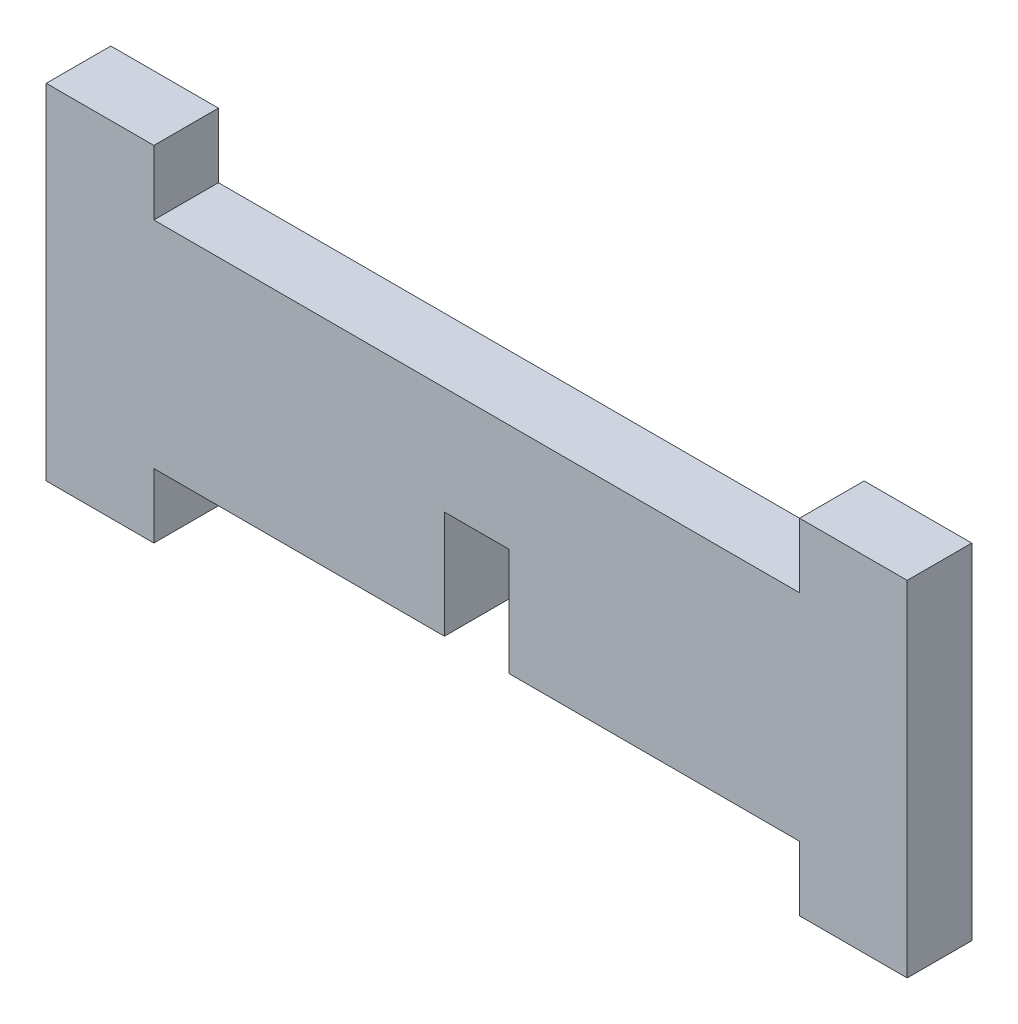
ISO-10303-21;
HEADER;
FILE_DESCRIPTION(('STEP AP214'),'2;1');
FILE_NAME('part.step','',(''),(''),'','','');
FILE_SCHEMA(('AUTOMOTIVE_DESIGN { 1 0 10303 214 1 1 1 1 }'));
ENDSEC;
DATA;
#1=APPLICATION_CONTEXT('core data for automotive mechanical design processes');
#2=APPLICATION_PROTOCOL_DEFINITION('international standard','automotive_design',2000,#1);
#3=PRODUCT_CONTEXT('',#1,'mechanical');
#4=PRODUCT('Part','Part','',(#3));
#5=PRODUCT_RELATED_PRODUCT_CATEGORY('part','',(#4));
#6=PRODUCT_DEFINITION_FORMATION('','',#4);
#7=PRODUCT_DEFINITION_CONTEXT('part definition',#1,'design');
#8=PRODUCT_DEFINITION('design','',#6,#7);
#9=PRODUCT_DEFINITION_SHAPE('','',#8);
#10=(LENGTH_UNIT() NAMED_UNIT(*) SI_UNIT(.MILLI.,.METRE.));
#11=(NAMED_UNIT(*) PLANE_ANGLE_UNIT() SI_UNIT($,.RADIAN.));
#12=(NAMED_UNIT(*) SI_UNIT($,.STERADIAN.) SOLID_ANGLE_UNIT());
#13=UNCERTAINTY_MEASURE_WITH_UNIT(LENGTH_MEASURE(1.E-05),#10,'distance_accuracy_value','');
#14=(GEOMETRIC_REPRESENTATION_CONTEXT(3) GLOBAL_UNCERTAINTY_ASSIGNED_CONTEXT((#13)) GLOBAL_UNIT_ASSIGNED_CONTEXT((#10,
#11,#12)) REPRESENTATION_CONTEXT('',''));
#15=CARTESIAN_POINT('',(0.,0.,0.));
#16=DIRECTION('',(0.,0.,1.));
#17=DIRECTION('',(1.,0.,0.));
#18=AXIS2_PLACEMENT_3D('',#15,#16,#17);
#19=CARTESIAN_POINT('',(-34.5604390862944,-10.4851945854484,3.));
#20=DIRECTION('',(0.,-1.,0.));
#21=DIRECTION('',(1.,0.,0.));
#22=AXIS2_PLACEMENT_3D('',#19,#20,#21);
#23=PLANE('',#22);
#24=DIRECTION('',(-1.,0.,0.));
#25=VECTOR('',#24,1.);
#26=CARTESIAN_POINT('',(-34.5604390862944,-10.4851945854484,0.));
#27=LINE('',#26,#25);
#28=CARTESIAN_POINT('',(-34.5604390862944,-10.4851945854484,0.));
#29=VERTEX_POINT('',#28);
#30=CARTESIAN_POINT('',(-39.5604390862944,-10.4851945854484,0.));
#31=VERTEX_POINT('',#30);
#32=EDGE_CURVE('E177',#29,#31,#27,.T.);
#33=ORIENTED_EDGE('',*,*,#32,.T.);
#34=DIRECTION('',(0.,0.,-1.));
#35=VECTOR('',#34,1.);
#36=CARTESIAN_POINT('',(-39.5604390862944,-10.4851945854484,3.));
#37=LINE('',#36,#35);
#38=CARTESIAN_POINT('',(-39.5604390862944,-10.4851945854484,3.));
#39=VERTEX_POINT('',#38);
#40=EDGE_CURVE('E11',#39,#31,#37,.T.);
#41=ORIENTED_EDGE('',*,*,#40,.F.);
#42=DIRECTION('',(-1.,0.,0.));
#43=VECTOR('',#42,1.);
#44=CARTESIAN_POINT('',(-34.5604390862944,-10.4851945854484,3.));
#45=LINE('',#44,#43);
#46=CARTESIAN_POINT('',(-34.5604390862944,-10.4851945854484,3.));
#47=VERTEX_POINT('',#46);
#48=EDGE_CURVE('E207',#47,#39,#45,.T.);
#49=ORIENTED_EDGE('',*,*,#48,.F.);
#50=DIRECTION('',(0.,0.,-1.));
#51=VECTOR('',#50,1.);
#52=CARTESIAN_POINT('',(-34.5604390862944,-10.4851945854484,3.));
#53=LINE('',#52,#51);
#54=EDGE_CURVE('E173',#47,#29,#53,.T.);
#55=ORIENTED_EDGE('',*,*,#54,.T.);
#56=EDGE_LOOP('',(#33,#41,#49,#55));
#57=FACE_BOUND('',#56,.T.);
#58=ADVANCED_FACE('F33',(#57),#23,.F.);
#59=CARTESIAN_POINT('',(-39.5604390862944,-10.4851945854484,3.));
#60=DIRECTION('',(1.,0.,0.));
#61=DIRECTION('',(0.,1.,0.));
#62=AXIS2_PLACEMENT_3D('',#59,#60,#61);
#63=PLANE('',#62);
#64=DIRECTION('',(0.,-1.,0.));
#65=VECTOR('',#64,1.);
#66=CARTESIAN_POINT('',(-39.5604390862944,-10.4851945854484,0.));
#67=LINE('',#66,#65);
#68=CARTESIAN_POINT('',(-39.5604390862944,-26.4851945854484,0.));
#69=VERTEX_POINT('',#68);
#70=EDGE_CURVE('E180',#31,#69,#67,.T.);
#71=ORIENTED_EDGE('',*,*,#70,.T.);
#72=DIRECTION('',(0.,0.,-1.));
#73=VECTOR('',#72,1.);
#74=CARTESIAN_POINT('',(-39.5604390862944,-26.4851945854484,3.));
#75=LINE('',#74,#73);
#76=CARTESIAN_POINT('',(-39.5604390862944,-26.4851945854484,3.));
#77=VERTEX_POINT('',#76);
#78=EDGE_CURVE('E41',#77,#69,#75,.T.);
#79=ORIENTED_EDGE('',*,*,#78,.F.);
#80=DIRECTION('',(0.,-1.,0.));
#81=VECTOR('',#80,1.);
#82=CARTESIAN_POINT('',(-39.5604390862944,-10.4851945854484,3.));
#83=LINE('',#82,#81);
#84=EDGE_CURVE('E116',#39,#77,#83,.T.);
#85=ORIENTED_EDGE('',*,*,#84,.F.);
#86=ORIENTED_EDGE('',*,*,#40,.T.);
#87=EDGE_LOOP('',(#71,#79,#85,#86));
#88=FACE_BOUND('',#87,.T.);
#89=ADVANCED_FACE('F305',(#88),#63,.F.);
#90=CARTESIAN_POINT('',(-39.5604390862944,-26.4851945854484,3.));
#91=DIRECTION('',(0.,1.,0.));
#92=DIRECTION('',(0.,0.,1.));
#93=AXIS2_PLACEMENT_3D('',#90,#91,#92);
#94=PLANE('',#93);
#95=DIRECTION('',(1.,0.,0.));
#96=VECTOR('',#95,1.);
#97=CARTESIAN_POINT('',(-39.5604390862944,-26.4851945854484,0.));
#98=LINE('',#97,#96);
#99=CARTESIAN_POINT('',(-34.5604390862944,-26.4851945854484,0.));
#100=VERTEX_POINT('',#99);
#101=EDGE_CURVE('E182',#69,#100,#98,.T.);
#102=ORIENTED_EDGE('',*,*,#101,.T.);
#103=DIRECTION('',(0.,0.,-1.));
#104=VECTOR('',#103,1.);
#105=CARTESIAN_POINT('',(-34.5604390862944,-26.4851945854484,3.));
#106=LINE('',#105,#104);
#107=CARTESIAN_POINT('',(-34.5604390862944,-26.4851945854484,3.));
#108=VERTEX_POINT('',#107);
#109=EDGE_CURVE('E238',#108,#100,#106,.T.);
#110=ORIENTED_EDGE('',*,*,#109,.F.);
#111=DIRECTION('',(1.,0.,0.));
#112=VECTOR('',#111,1.);
#113=CARTESIAN_POINT('',(-39.5604390862944,-26.4851945854484,3.));
#114=LINE('',#113,#112);
#115=EDGE_CURVE('E246',#77,#108,#114,.T.);
#116=ORIENTED_EDGE('',*,*,#115,.F.);
#117=ORIENTED_EDGE('',*,*,#78,.T.);
#118=EDGE_LOOP('',(#102,#110,#116,#117));
#119=FACE_BOUND('',#118,.T.);
#120=ADVANCED_FACE('F244',(#119),#94,.F.);
#121=CARTESIAN_POINT('',(-34.5604390862944,-26.4851945854484,3.));
#122=DIRECTION('',(-1.,0.,0.));
#123=DIRECTION('',(0.,0.,1.));
#124=AXIS2_PLACEMENT_3D('',#121,#122,#123);
#125=PLANE('',#124);
#126=DIRECTION('',(0.,1.,0.));
#127=VECTOR('',#126,1.);
#128=CARTESIAN_POINT('',(-34.5604390862944,-26.4851945854484,0.));
#129=LINE('',#128,#127);
#130=CARTESIAN_POINT('',(-34.5604390862944,-23.4851945854484,0.));
#131=VERTEX_POINT('',#130);
#132=EDGE_CURVE('E184',#100,#131,#129,.T.);
#133=ORIENTED_EDGE('',*,*,#132,.T.);
#134=DIRECTION('',(0.,0.,-1.));
#135=VECTOR('',#134,1.);
#136=CARTESIAN_POINT('',(-34.5604390862944,-23.4851945854484,3.));
#137=LINE('',#136,#135);
#138=CARTESIAN_POINT('',(-34.5604390862944,-23.4851945854484,3.));
#139=VERTEX_POINT('',#138);
#140=EDGE_CURVE('E235',#139,#131,#137,.T.);
#141=ORIENTED_EDGE('',*,*,#140,.F.);
#142=DIRECTION('',(0.,1.,0.));
#143=VECTOR('',#142,1.);
#144=CARTESIAN_POINT('',(-34.5604390862944,-26.4851945854484,3.));
#145=LINE('',#144,#143);
#146=EDGE_CURVE('E264',#108,#139,#145,.T.);
#147=ORIENTED_EDGE('',*,*,#146,.F.);
#148=ORIENTED_EDGE('',*,*,#109,.T.);
#149=EDGE_LOOP('',(#133,#141,#147,#148));
#150=FACE_BOUND('',#149,.T.);
#151=ADVANCED_FACE('F255',(#150),#125,.F.);
#152=CARTESIAN_POINT('',(-34.5604390862944,-23.4851945854484,3.));
#153=DIRECTION('',(0.,1.,0.));
#154=DIRECTION('',(0.,0.,1.));
#155=AXIS2_PLACEMENT_3D('',#152,#153,#154);
#156=PLANE('',#155);
#157=DIRECTION('',(1.,0.,0.));
#158=VECTOR('',#157,1.);
#159=CARTESIAN_POINT('',(-34.5604390862944,-23.4851945854484,0.));
#160=LINE('',#159,#158);
#161=CARTESIAN_POINT('',(-21.0604390862944,-23.4851945854484,0.));
#162=VERTEX_POINT('',#161);
#163=EDGE_CURVE('E186',#131,#162,#160,.T.);
#164=ORIENTED_EDGE('',*,*,#163,.T.);
#165=DIRECTION('',(0.,0.,-1.));
#166=VECTOR('',#165,1.);
#167=CARTESIAN_POINT('',(-21.0604390862944,-23.4851945854484,3.));
#168=LINE('',#167,#166);
#169=CARTESIAN_POINT('',(-21.0604390862944,-23.4851945854484,3.));
#170=VERTEX_POINT('',#169);
#171=EDGE_CURVE('E232',#170,#162,#168,.T.);
#172=ORIENTED_EDGE('',*,*,#171,.F.);
#173=DIRECTION('',(1.,0.,0.));
#174=VECTOR('',#173,1.);
#175=CARTESIAN_POINT('',(-34.5604390862944,-23.4851945854484,3.));
#176=LINE('',#175,#174);
#177=EDGE_CURVE('E261',#139,#170,#176,.T.);
#178=ORIENTED_EDGE('',*,*,#177,.F.);
#179=ORIENTED_EDGE('',*,*,#140,.T.);
#180=EDGE_LOOP('',(#164,#172,#178,#179));
#181=FACE_BOUND('',#180,.T.);
#182=ADVANCED_FACE('F259',(#181),#156,.F.);
#183=CARTESIAN_POINT('',(-21.0604390862944,-23.4851945854484,3.));
#184=DIRECTION('',(-1.,0.,0.));
#185=DIRECTION('',(0.,0.,1.));
#186=AXIS2_PLACEMENT_3D('',#183,#184,#185);
#187=PLANE('',#186);
#188=DIRECTION('',(0.,1.,0.));
#189=VECTOR('',#188,1.);
#190=CARTESIAN_POINT('',(-21.0604390862944,-23.4851945854484,0.));
#191=LINE('',#190,#189);
#192=CARTESIAN_POINT('',(-21.0604390862944,-18.4851945854484,0.));
#193=VERTEX_POINT('',#192);
#194=EDGE_CURVE('E188',#162,#193,#191,.T.);
#195=ORIENTED_EDGE('',*,*,#194,.T.);
#196=DIRECTION('',(0.,0.,-1.));
#197=VECTOR('',#196,1.);
#198=CARTESIAN_POINT('',(-21.0604390862944,-18.4851945854484,3.));
#199=LINE('',#198,#197);
#200=CARTESIAN_POINT('',(-21.0604390862944,-18.4851945854484,3.));
#201=VERTEX_POINT('',#200);
#202=EDGE_CURVE('E229',#201,#193,#199,.T.);
#203=ORIENTED_EDGE('',*,*,#202,.F.);
#204=DIRECTION('',(0.,1.,0.));
#205=VECTOR('',#204,1.);
#206=CARTESIAN_POINT('',(-21.0604390862944,-23.4851945854484,3.));
#207=LINE('',#206,#205);
#208=EDGE_CURVE('E263',#170,#201,#207,.T.);
#209=ORIENTED_EDGE('',*,*,#208,.F.);
#210=ORIENTED_EDGE('',*,*,#171,.T.);
#211=EDGE_LOOP('',(#195,#203,#209,#210));
#212=FACE_BOUND('',#211,.T.);
#213=ADVANCED_FACE('F318',(#212),#187,.F.);
#214=CARTESIAN_POINT('',(-21.0604390862944,-18.4851945854484,3.));
#215=DIRECTION('',(0.,1.,0.));
#216=DIRECTION('',(0.,0.,1.));
#217=AXIS2_PLACEMENT_3D('',#214,#215,#216);
#218=PLANE('',#217);
#219=DIRECTION('',(1.,0.,0.));
#220=VECTOR('',#219,1.);
#221=CARTESIAN_POINT('',(-21.0604390862944,-18.4851945854484,0.));
#222=LINE('',#221,#220);
#223=CARTESIAN_POINT('',(-18.0604390862944,-18.4851945854484,0.));
#224=VERTEX_POINT('',#223);
#225=EDGE_CURVE('E190',#193,#224,#222,.T.);
#226=ORIENTED_EDGE('',*,*,#225,.T.);
#227=DIRECTION('',(0.,0.,-1.));
#228=VECTOR('',#227,1.);
#229=CARTESIAN_POINT('',(-18.0604390862944,-18.4851945854484,3.));
#230=LINE('',#229,#228);
#231=CARTESIAN_POINT('',(-18.0604390862944,-18.4851945854484,3.));
#232=VERTEX_POINT('',#231);
#233=EDGE_CURVE('E226',#232,#224,#230,.T.);
#234=ORIENTED_EDGE('',*,*,#233,.F.);
#235=DIRECTION('',(1.,0.,0.));
#236=VECTOR('',#235,1.);
#237=CARTESIAN_POINT('',(-21.0604390862944,-18.4851945854484,3.));
#238=LINE('',#237,#236);
#239=EDGE_CURVE('E266',#201,#232,#238,.T.);
#240=ORIENTED_EDGE('',*,*,#239,.F.);
#241=ORIENTED_EDGE('',*,*,#202,.T.);
#242=EDGE_LOOP('',(#226,#234,#240,#241));
#243=FACE_BOUND('',#242,.T.);
#244=ADVANCED_FACE('F321',(#243),#218,.F.);
#245=CARTESIAN_POINT('',(-18.0604390862944,-18.4851945854484,3.));
#246=DIRECTION('',(1.,0.,0.));
#247=DIRECTION('',(0.,1.,0.));
#248=AXIS2_PLACEMENT_3D('',#245,#246,#247);
#249=PLANE('',#248);
#250=DIRECTION('',(0.,-1.,0.));
#251=VECTOR('',#250,1.);
#252=CARTESIAN_POINT('',(-18.0604390862944,-18.4851945854484,0.));
#253=LINE('',#252,#251);
#254=CARTESIAN_POINT('',(-18.0604390862944,-23.4851945854484,0.));
#255=VERTEX_POINT('',#254);
#256=EDGE_CURVE('E192',#224,#255,#253,.T.);
#257=ORIENTED_EDGE('',*,*,#256,.T.);
#258=DIRECTION('',(0.,0.,-1.));
#259=VECTOR('',#258,1.);
#260=CARTESIAN_POINT('',(-18.0604390862944,-23.4851945854484,3.));
#261=LINE('',#260,#259);
#262=CARTESIAN_POINT('',(-18.0604390862944,-23.4851945854484,3.));
#263=VERTEX_POINT('',#262);
#264=EDGE_CURVE('E223',#263,#255,#261,.T.);
#265=ORIENTED_EDGE('',*,*,#264,.F.);
#266=DIRECTION('',(0.,-1.,0.));
#267=VECTOR('',#266,1.);
#268=CARTESIAN_POINT('',(-18.0604390862944,-18.4851945854484,3.));
#269=LINE('',#268,#267);
#270=EDGE_CURVE('E272',#232,#263,#269,.T.);
#271=ORIENTED_EDGE('',*,*,#270,.F.);
#272=ORIENTED_EDGE('',*,*,#233,.T.);
#273=EDGE_LOOP('',(#257,#265,#271,#272));
#274=FACE_BOUND('',#273,.T.);
#275=ADVANCED_FACE('F325',(#274),#249,.F.);
#276=CARTESIAN_POINT('',(-18.0604390862944,-23.4851945854484,3.));
#277=DIRECTION('',(0.,1.,0.));
#278=DIRECTION('',(0.,0.,1.));
#279=AXIS2_PLACEMENT_3D('',#276,#277,#278);
#280=PLANE('',#279);
#281=DIRECTION('',(1.,0.,0.));
#282=VECTOR('',#281,1.);
#283=CARTESIAN_POINT('',(-18.0604390862944,-23.4851945854484,0.));
#284=LINE('',#283,#282);
#285=CARTESIAN_POINT('',(-4.56043908629442,-23.4851945854484,0.));
#286=VERTEX_POINT('',#285);
#287=EDGE_CURVE('E194',#255,#286,#284,.T.);
#288=ORIENTED_EDGE('',*,*,#287,.T.);
#289=DIRECTION('',(0.,0.,-1.));
#290=VECTOR('',#289,1.);
#291=CARTESIAN_POINT('',(-4.56043908629442,-23.4851945854484,3.));
#292=LINE('',#291,#290);
#293=CARTESIAN_POINT('',(-4.56043908629442,-23.4851945854484,3.));
#294=VERTEX_POINT('',#293);
#295=EDGE_CURVE('E220',#294,#286,#292,.T.);
#296=ORIENTED_EDGE('',*,*,#295,.F.);
#297=DIRECTION('',(1.,0.,0.));
#298=VECTOR('',#297,1.);
#299=CARTESIAN_POINT('',(-18.0604390862944,-23.4851945854484,3.));
#300=LINE('',#299,#298);
#301=EDGE_CURVE('E274',#263,#294,#300,.T.);
#302=ORIENTED_EDGE('',*,*,#301,.F.);
#303=ORIENTED_EDGE('',*,*,#264,.T.);
#304=EDGE_LOOP('',(#288,#296,#302,#303));
#305=FACE_BOUND('',#304,.T.);
#306=ADVANCED_FACE('F329',(#305),#280,.F.);
#307=CARTESIAN_POINT('',(-4.56043908629442,-23.4851945854484,3.));
#308=DIRECTION('',(1.,0.,0.));
#309=DIRECTION('',(0.,0.,-1.));
#310=AXIS2_PLACEMENT_3D('',#307,#308,#309);
#311=PLANE('',#310);
#312=DIRECTION('',(0.,-1.,0.));
#313=VECTOR('',#312,1.);
#314=CARTESIAN_POINT('',(-4.56043908629442,-23.4851945854484,0.));
#315=LINE('',#314,#313);
#316=CARTESIAN_POINT('',(-4.56043908629442,-26.4851945854484,0.));
#317=VERTEX_POINT('',#316);
#318=EDGE_CURVE('E196',#286,#317,#315,.T.);
#319=ORIENTED_EDGE('',*,*,#318,.T.);
#320=DIRECTION('',(0.,0.,-1.));
#321=VECTOR('',#320,1.);
#322=CARTESIAN_POINT('',(-4.56043908629442,-26.4851945854484,3.));
#323=LINE('',#322,#321);
#324=CARTESIAN_POINT('',(-4.56043908629442,-26.4851945854484,3.));
#325=VERTEX_POINT('',#324);
#326=EDGE_CURVE('E217',#325,#317,#323,.T.);
#327=ORIENTED_EDGE('',*,*,#326,.F.);
#328=DIRECTION('',(0.,-1.,0.));
#329=VECTOR('',#328,1.);
#330=CARTESIAN_POINT('',(-4.56043908629442,-23.4851945854484,3.));
#331=LINE('',#330,#329);
#332=EDGE_CURVE('E276',#294,#325,#331,.T.);
#333=ORIENTED_EDGE('',*,*,#332,.F.);
#334=ORIENTED_EDGE('',*,*,#295,.T.);
#335=EDGE_LOOP('',(#319,#327,#333,#334));
#336=FACE_BOUND('',#335,.T.);
#337=ADVANCED_FACE('F333',(#336),#311,.F.);
#338=CARTESIAN_POINT('',(-4.56043908629442,-26.4851945854484,3.));
#339=DIRECTION('',(0.,1.,0.));
#340=DIRECTION('',(0.,0.,1.));
#341=AXIS2_PLACEMENT_3D('',#338,#339,#340);
#342=PLANE('',#341);
#343=DIRECTION('',(1.,0.,0.));
#344=VECTOR('',#343,1.);
#345=CARTESIAN_POINT('',(-4.56043908629442,-26.4851945854484,0.));
#346=LINE('',#345,#344);
#347=CARTESIAN_POINT('',(0.439560913705582,-26.4851945854484,0.));
#348=VERTEX_POINT('',#347);
#349=EDGE_CURVE('E198',#317,#348,#346,.T.);
#350=ORIENTED_EDGE('',*,*,#349,.T.);
#351=DIRECTION('',(0.,0.,-1.));
#352=VECTOR('',#351,1.);
#353=CARTESIAN_POINT('',(0.439560913705582,-26.4851945854484,3.));
#354=LINE('',#353,#352);
#355=CARTESIAN_POINT('',(0.439560913705582,-26.4851945854484,3.));
#356=VERTEX_POINT('',#355);
#357=EDGE_CURVE('E214',#356,#348,#354,.T.);
#358=ORIENTED_EDGE('',*,*,#357,.F.);
#359=DIRECTION('',(1.,0.,0.));
#360=VECTOR('',#359,1.);
#361=CARTESIAN_POINT('',(-4.56043908629442,-26.4851945854484,3.));
#362=LINE('',#361,#360);
#363=EDGE_CURVE('E278',#325,#356,#362,.T.);
#364=ORIENTED_EDGE('',*,*,#363,.F.);
#365=ORIENTED_EDGE('',*,*,#326,.T.);
#366=EDGE_LOOP('',(#350,#358,#364,#365));
#367=FACE_BOUND('',#366,.T.);
#368=ADVANCED_FACE('F337',(#367),#342,.F.);
#369=CARTESIAN_POINT('',(0.439560913705582,-26.4851945854484,3.));
#370=DIRECTION('',(-1.,0.,0.));
#371=DIRECTION('',(0.,0.,1.));
#372=AXIS2_PLACEMENT_3D('',#369,#370,#371);
#373=PLANE('',#372);
#374=DIRECTION('',(0.,1.,0.));
#375=VECTOR('',#374,1.);
#376=CARTESIAN_POINT('',(0.439560913705582,-26.4851945854484,0.));
#377=LINE('',#376,#375);
#378=CARTESIAN_POINT('',(0.439560913705582,-10.4851945854484,0.));
#379=VERTEX_POINT('',#378);
#380=EDGE_CURVE('E200',#348,#379,#377,.T.);
#381=ORIENTED_EDGE('',*,*,#380,.T.);
#382=DIRECTION('',(0.,0.,-1.));
#383=VECTOR('',#382,1.);
#384=CARTESIAN_POINT('',(0.439560913705582,-10.4851945854484,3.));
#385=LINE('',#384,#383);
#386=CARTESIAN_POINT('',(0.439560913705582,-10.4851945854484,3.));
#387=VERTEX_POINT('',#386);
#388=EDGE_CURVE('E211',#387,#379,#385,.T.);
#389=ORIENTED_EDGE('',*,*,#388,.F.);
#390=DIRECTION('',(0.,1.,0.));
#391=VECTOR('',#390,1.);
#392=CARTESIAN_POINT('',(0.439560913705582,-26.4851945854484,3.));
#393=LINE('',#392,#391);
#394=EDGE_CURVE('E280',#356,#387,#393,.T.);
#395=ORIENTED_EDGE('',*,*,#394,.F.);
#396=ORIENTED_EDGE('',*,*,#357,.T.);
#397=EDGE_LOOP('',(#381,#389,#395,#396));
#398=FACE_BOUND('',#397,.T.);
#399=ADVANCED_FACE('F286',(#398),#373,.F.);
#400=CARTESIAN_POINT('',(0.439560913705582,-10.4851945854484,3.));
#401=DIRECTION('',(0.,-1.,0.));
#402=DIRECTION('',(0.,0.,-1.));
#403=AXIS2_PLACEMENT_3D('',#400,#401,#402);
#404=PLANE('',#403);
#405=DIRECTION('',(-1.,0.,0.));
#406=VECTOR('',#405,1.);
#407=CARTESIAN_POINT('',(0.439560913705582,-10.4851945854484,0.));
#408=LINE('',#407,#406);
#409=CARTESIAN_POINT('',(-4.56043908629442,-10.4851945854484,0.));
#410=VERTEX_POINT('',#409);
#411=EDGE_CURVE('E202',#379,#410,#408,.T.);
#412=ORIENTED_EDGE('',*,*,#411,.T.);
#413=DIRECTION('',(0.,0.,-1.));
#414=VECTOR('',#413,1.);
#415=CARTESIAN_POINT('',(-4.56043908629442,-10.4851945854484,3.));
#416=LINE('',#415,#414);
#417=CARTESIAN_POINT('',(-4.56043908629442,-10.4851945854484,3.));
#418=VERTEX_POINT('',#417);
#419=EDGE_CURVE('E168',#418,#410,#416,.T.);
#420=ORIENTED_EDGE('',*,*,#419,.F.);
#421=DIRECTION('',(-1.,0.,0.));
#422=VECTOR('',#421,1.);
#423=CARTESIAN_POINT('',(0.439560913705582,-10.4851945854484,3.));
#424=LINE('',#423,#422);
#425=EDGE_CURVE('E159',#387,#418,#424,.T.);
#426=ORIENTED_EDGE('',*,*,#425,.F.);
#427=ORIENTED_EDGE('',*,*,#388,.T.);
#428=EDGE_LOOP('',(#412,#420,#426,#427));
#429=FACE_BOUND('',#428,.T.);
#430=ADVANCED_FACE('F290',(#429),#404,.F.);
#431=CARTESIAN_POINT('',(-4.56043908629442,-10.4851945854484,3.));
#432=DIRECTION('',(1.,0.,0.));
#433=DIRECTION('',(0.,0.,-1.));
#434=AXIS2_PLACEMENT_3D('',#431,#432,#433);
#435=PLANE('',#434);
#436=DIRECTION('',(0.,-1.,0.));
#437=VECTOR('',#436,1.);
#438=CARTESIAN_POINT('',(-4.56043908629442,-10.4851945854484,0.));
#439=LINE('',#438,#437);
#440=CARTESIAN_POINT('',(-4.56043908629442,-13.4851945854484,0.));
#441=VERTEX_POINT('',#440);
#442=EDGE_CURVE('E167',#410,#441,#439,.T.);
#443=ORIENTED_EDGE('',*,*,#442,.T.);
#444=DIRECTION('',(0.,0.,-1.));
#445=VECTOR('',#444,1.);
#446=CARTESIAN_POINT('',(-4.56043908629442,-13.4851945854484,3.));
#447=LINE('',#446,#445);
#448=CARTESIAN_POINT('',(-4.56043908629442,-13.4851945854484,3.));
#449=VERTEX_POINT('',#448);
#450=EDGE_CURVE('E164',#449,#441,#447,.T.);
#451=ORIENTED_EDGE('',*,*,#450,.F.);
#452=DIRECTION('',(0.,-1.,0.));
#453=VECTOR('',#452,1.);
#454=CARTESIAN_POINT('',(-4.56043908629442,-10.4851945854484,3.));
#455=LINE('',#454,#453);
#456=EDGE_CURVE('E153',#418,#449,#455,.T.);
#457=ORIENTED_EDGE('',*,*,#456,.F.);
#458=ORIENTED_EDGE('',*,*,#419,.T.);
#459=EDGE_LOOP('',(#443,#451,#457,#458));
#460=FACE_BOUND('',#459,.T.);
#461=ADVANCED_FACE('F165',(#460),#435,.F.);
#462=CARTESIAN_POINT('',(-4.56043908629442,-13.4851945854484,3.));
#463=DIRECTION('',(0.,-1.,0.));
#464=DIRECTION('',(1.,0.,0.));
#465=AXIS2_PLACEMENT_3D('',#462,#463,#464);
#466=PLANE('',#465);
#467=DIRECTION('',(-1.,0.,0.));
#468=VECTOR('',#467,1.);
#469=CARTESIAN_POINT('',(-4.56043908629442,-13.4851945854484,0.));
#470=LINE('',#469,#468);
#471=CARTESIAN_POINT('',(-34.5604390862944,-13.4851945854484,0.));
#472=VERTEX_POINT('',#471);
#473=EDGE_CURVE('E102',#441,#472,#470,.T.);
#474=ORIENTED_EDGE('',*,*,#473,.T.);
#475=DIRECTION('',(0.,0.,-1.));
#476=VECTOR('',#475,1.);
#477=CARTESIAN_POINT('',(-34.5604390862944,-13.4851945854484,3.));
#478=LINE('',#477,#476);
#479=CARTESIAN_POINT('',(-34.5604390862944,-13.4851945854484,3.));
#480=VERTEX_POINT('',#479);
#481=EDGE_CURVE('E169',#480,#472,#478,.T.);
#482=ORIENTED_EDGE('',*,*,#481,.F.);
#483=DIRECTION('',(-1.,0.,0.));
#484=VECTOR('',#483,1.);
#485=CARTESIAN_POINT('',(-4.56043908629442,-13.4851945854484,3.));
#486=LINE('',#485,#484);
#487=EDGE_CURVE('E157',#449,#480,#486,.T.);
#488=ORIENTED_EDGE('',*,*,#487,.F.);
#489=ORIENTED_EDGE('',*,*,#450,.T.);
#490=EDGE_LOOP('',(#474,#482,#488,#489));
#491=FACE_BOUND('',#490,.T.);
#492=ADVANCED_FACE('F171',(#491),#466,.F.);
#493=CARTESIAN_POINT('',(-34.5604390862944,-13.4851945854484,3.));
#494=DIRECTION('',(-1.,0.,0.));
#495=DIRECTION('',(0.,0.,1.));
#496=AXIS2_PLACEMENT_3D('',#493,#494,#495);
#497=PLANE('',#496);
#498=DIRECTION('',(0.,1.,0.));
#499=VECTOR('',#498,1.);
#500=CARTESIAN_POINT('',(-34.5604390862944,-13.4851945854484,0.));
#501=LINE('',#500,#499);
#502=EDGE_CURVE('E108',#472,#29,#501,.T.);
#503=ORIENTED_EDGE('',*,*,#502,.T.);
#504=ORIENTED_EDGE('',*,*,#54,.F.);
#505=DIRECTION('',(0.,1.,0.));
#506=VECTOR('',#505,1.);
#507=CARTESIAN_POINT('',(-34.5604390862944,-13.4851945854484,3.));
#508=LINE('',#507,#506);
#509=EDGE_CURVE('E49',#480,#47,#508,.T.);
#510=ORIENTED_EDGE('',*,*,#509,.F.);
#511=ORIENTED_EDGE('',*,*,#481,.T.);
#512=EDGE_LOOP('',(#503,#504,#510,#511));
#513=FACE_BOUND('',#512,.T.);
#514=ADVANCED_FACE('F294',(#513),#497,.F.);
#515=CARTESIAN_POINT('',(0.,0.,3.));
#516=DIRECTION('',(0.,0.,1.));
#517=DIRECTION('',(1.,0.,0.));
#518=AXIS2_PLACEMENT_3D('',#515,#516,#517);
#519=PLANE('',#518);
#520=ORIENTED_EDGE('',*,*,#48,.T.);
#521=ORIENTED_EDGE('',*,*,#84,.T.);
#522=ORIENTED_EDGE('',*,*,#115,.T.);
#523=ORIENTED_EDGE('',*,*,#146,.T.);
#524=ORIENTED_EDGE('',*,*,#177,.T.);
#525=ORIENTED_EDGE('',*,*,#208,.T.);
#526=ORIENTED_EDGE('',*,*,#239,.T.);
#527=ORIENTED_EDGE('',*,*,#270,.T.);
#528=ORIENTED_EDGE('',*,*,#301,.T.);
#529=ORIENTED_EDGE('',*,*,#332,.T.);
#530=ORIENTED_EDGE('',*,*,#363,.T.);
#531=ORIENTED_EDGE('',*,*,#394,.T.);
#532=ORIENTED_EDGE('',*,*,#425,.T.);
#533=ORIENTED_EDGE('',*,*,#456,.T.);
#534=ORIENTED_EDGE('',*,*,#487,.T.);
#535=ORIENTED_EDGE('',*,*,#509,.T.);
#536=EDGE_LOOP('',(#520,#521,#522,#523,#524,#525,#526,#527,#528,#529,#530,#531,#532,#533,#534,#535));
#537=FACE_BOUND('',#536,.T.);
#538=ADVANCED_FACE('F155',(#537),#519,.T.);
#539=CARTESIAN_POINT('',(0.,0.,0.));
#540=DIRECTION('',(0.,0.,1.));
#541=DIRECTION('',(1.,0.,0.));
#542=AXIS2_PLACEMENT_3D('',#539,#540,#541);
#543=PLANE('',#542);
#544=ORIENTED_EDGE('',*,*,#32,.F.);
#545=ORIENTED_EDGE('',*,*,#502,.F.);
#546=ORIENTED_EDGE('',*,*,#473,.F.);
#547=ORIENTED_EDGE('',*,*,#442,.F.);
#548=ORIENTED_EDGE('',*,*,#411,.F.);
#549=ORIENTED_EDGE('',*,*,#380,.F.);
#550=ORIENTED_EDGE('',*,*,#349,.F.);
#551=ORIENTED_EDGE('',*,*,#318,.F.);
#552=ORIENTED_EDGE('',*,*,#287,.F.);
#553=ORIENTED_EDGE('',*,*,#256,.F.);
#554=ORIENTED_EDGE('',*,*,#225,.F.);
#555=ORIENTED_EDGE('',*,*,#194,.F.);
#556=ORIENTED_EDGE('',*,*,#163,.F.);
#557=ORIENTED_EDGE('',*,*,#132,.F.);
#558=ORIENTED_EDGE('',*,*,#101,.F.);
#559=ORIENTED_EDGE('',*,*,#70,.F.);
#560=EDGE_LOOP('',(#544,#545,#546,#547,#548,#549,#550,#551,#552,#553,#554,#555,#556,#557,#558,#559));
#561=FACE_BOUND('',#560,.T.);
#562=ADVANCED_FACE('F250',(#561),#543,.F.);
#563=CLOSED_SHELL('',(#58,#89,#120,#151,#182,#213,#244,#275,#306,#337,#368,#399,#430,#461,#492,
#514,#538,#562));
#564=MANIFOLD_SOLID_BREP('B2',#563);
#565=ADVANCED_BREP_SHAPE_REPRESENTATION('',(#18,#564),#14);
#566=SHAPE_DEFINITION_REPRESENTATION(#9,#565);
ENDSEC;
END-ISO-10303-21;
